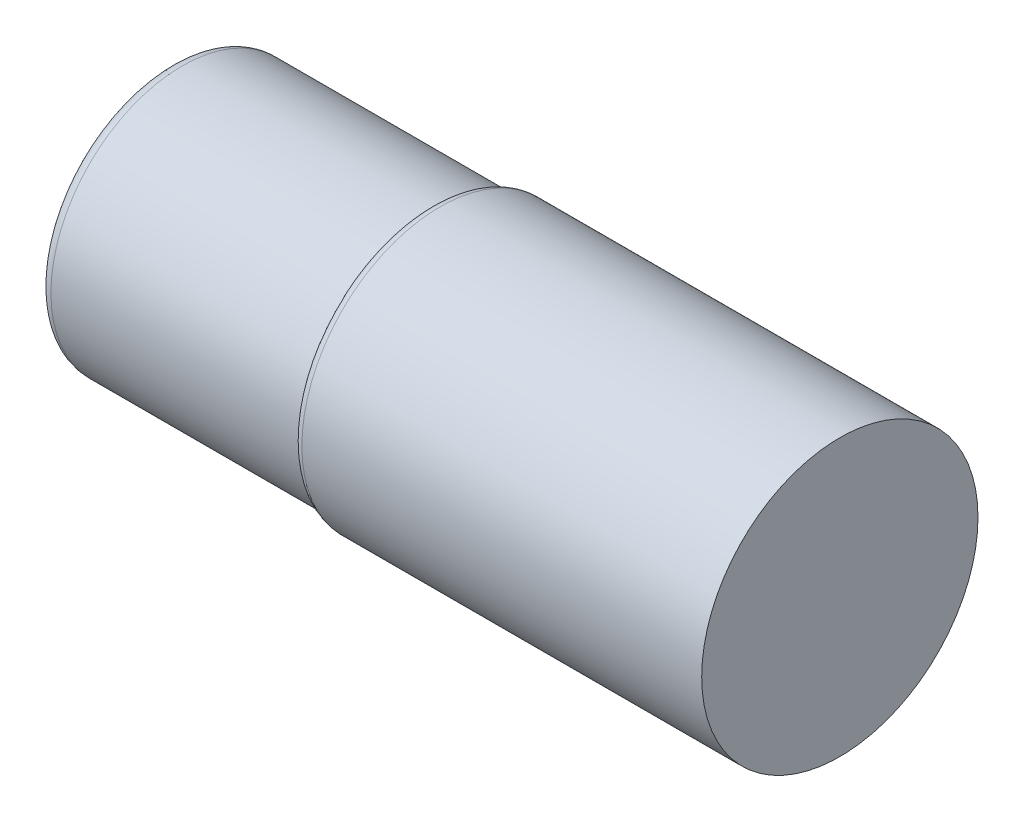
ISO-10303-21;
HEADER;
FILE_DESCRIPTION(('STEP AP214'),'2;1');
FILE_NAME('part.step','',(''),(''),'','','');
FILE_SCHEMA(('AUTOMOTIVE_DESIGN { 1 0 10303 214 1 1 1 1 }'));
ENDSEC;
DATA;
#1=APPLICATION_CONTEXT('core data for automotive mechanical design processes');
#2=APPLICATION_PROTOCOL_DEFINITION('international standard','automotive_design',2000,#1);
#3=PRODUCT_CONTEXT('',#1,'mechanical');
#4=PRODUCT('Part','Part','',(#3));
#5=PRODUCT_RELATED_PRODUCT_CATEGORY('part','',(#4));
#6=PRODUCT_DEFINITION_FORMATION('','',#4);
#7=PRODUCT_DEFINITION_CONTEXT('part definition',#1,'design');
#8=PRODUCT_DEFINITION('design','',#6,#7);
#9=PRODUCT_DEFINITION_SHAPE('','',#8);
#10=(LENGTH_UNIT() NAMED_UNIT(*) SI_UNIT(.MILLI.,.METRE.));
#11=(NAMED_UNIT(*) PLANE_ANGLE_UNIT() SI_UNIT($,.RADIAN.));
#12=(NAMED_UNIT(*) SI_UNIT($,.STERADIAN.) SOLID_ANGLE_UNIT());
#13=UNCERTAINTY_MEASURE_WITH_UNIT(LENGTH_MEASURE(1.E-05),#10,'distance_accuracy_value','');
#14=(GEOMETRIC_REPRESENTATION_CONTEXT(3) GLOBAL_UNCERTAINTY_ASSIGNED_CONTEXT((#13)) GLOBAL_UNIT_ASSIGNED_CONTEXT((#10,
#11,#12)) REPRESENTATION_CONTEXT('',''));
#15=CARTESIAN_POINT('',(0.,0.,0.));
#16=DIRECTION('',(0.,0.,1.));
#17=DIRECTION('',(1.,0.,0.));
#18=AXIS2_PLACEMENT_3D('',#15,#16,#17);
#19=CARTESIAN_POINT('',(111.2,0.,0.));
#20=DIRECTION('',(-1.,0.,0.));
#21=DIRECTION('',(0.,0.,1.));
#22=AXIS2_PLACEMENT_3D('',#19,#20,#21);
#23=PLANE('',#22);
#24=CARTESIAN_POINT('',(111.2,0.,0.));
#25=DIRECTION('',(-1.,0.,0.));
#26=DIRECTION('',(0.,0.,1.));
#27=AXIS2_PLACEMENT_3D('',#24,#25,#26);
#28=CIRCLE('',#27,23.15);
#29=CARTESIAN_POINT('',(111.2,0.,23.15));
#30=VERTEX_POINT('',#29);
#31=EDGE_CURVE('E95',#30,#30,#28,.T.);
#32=ORIENTED_EDGE('',*,*,#31,.F.);
#33=EDGE_LOOP('',(#32));
#34=FACE_BOUND('',#33,.T.);
#35=ADVANCED_FACE('F53',(#34),#23,.F.);
#36=CARTESIAN_POINT('',(0.,0.,0.));
#37=DIRECTION('',(-1.,0.,0.));
#38=DIRECTION('',(0.,0.,1.));
#39=AXIS2_PLACEMENT_3D('',#36,#37,#38);
#40=CYLINDRICAL_SURFACE('',#39,23.15);
#41=CARTESIAN_POINT('',(44.2,0.,0.));
#42=DIRECTION('',(-1.,0.,0.));
#43=DIRECTION('',(0.,0.,1.));
#44=AXIS2_PLACEMENT_3D('',#41,#42,#43);
#45=CIRCLE('',#44,23.15);
#46=CARTESIAN_POINT('',(44.2,0.,23.15));
#47=VERTEX_POINT('',#46);
#48=EDGE_CURVE('E100',#47,#47,#45,.T.);
#49=ORIENTED_EDGE('',*,*,#48,.F.);
#50=EDGE_LOOP('',(#49));
#51=FACE_BOUND('',#50,.T.);
#52=ORIENTED_EDGE('',*,*,#31,.T.);
#53=EDGE_LOOP('',(#52));
#54=FACE_BOUND('',#53,.T.);
#55=ADVANCED_FACE('F171',(#51,#54),#40,.T.);
#56=CARTESIAN_POINT('',(44.2,0.,0.));
#57=DIRECTION('',(-1.,0.,0.));
#58=DIRECTION('',(0.,0.,1.));
#59=AXIS2_PLACEMENT_3D('',#56,#57,#58);
#60=TOROIDAL_SURFACE('',#59,21.65,1.5);
#61=CARTESIAN_POINT('',(42.7414047854185,0.,0.));
#62=DIRECTION('',(1.,0.,0.));
#63=DIRECTION('',(0.,0.,-1.));
#64=AXIS2_PLACEMENT_3D('',#61,#62,#63);
#65=CIRCLE('',#64,22.);
#66=CARTESIAN_POINT('',(42.7414047854185,0.,-22.));
#67=VERTEX_POINT('',#66);
#68=EDGE_CURVE('E57',#67,#67,#65,.F.);
#69=ORIENTED_EDGE('',*,*,#68,.F.);
#70=EDGE_LOOP('',(#69));
#71=FACE_BOUND('',#70,.T.);
#72=ORIENTED_EDGE('',*,*,#48,.T.);
#73=EDGE_LOOP('',(#72));
#74=FACE_BOUND('',#73,.T.);
#75=ADVANCED_FACE('F55',(#71,#74),#60,.T.);
#76=CARTESIAN_POINT('',(0.,0.,0.));
#77=DIRECTION('',(-1.,0.,0.));
#78=DIRECTION('',(0.,0.,1.));
#79=AXIS2_PLACEMENT_3D('',#76,#77,#78);
#80=CYLINDRICAL_SURFACE('',#79,22.);
#81=CARTESIAN_POINT('',(1.,0.,0.));
#82=DIRECTION('',(-1.,0.,0.));
#83=DIRECTION('',(0.,0.,1.));
#84=AXIS2_PLACEMENT_3D('',#81,#82,#83);
#85=CIRCLE('',#84,22.);
#86=CARTESIAN_POINT('',(1.,0.,22.));
#87=VERTEX_POINT('',#86);
#88=EDGE_CURVE('E62',#87,#87,#85,.F.);
#89=ORIENTED_EDGE('',*,*,#88,.T.);
#90=EDGE_LOOP('',(#89));
#91=FACE_BOUND('',#90,.T.);
#92=ORIENTED_EDGE('',*,*,#68,.T.);
#93=EDGE_LOOP('',(#92));
#94=FACE_BOUND('',#93,.T.);
#95=ADVANCED_FACE('F151',(#91,#94),#80,.T.);
#96=CARTESIAN_POINT('',(-1.,0.,0.));
#97=DIRECTION('',(1.,0.,0.));
#98=DIRECTION('',(0.,0.,-1.));
#99=AXIS2_PLACEMENT_3D('',#96,#97,#98);
#100=PLANE('',#99);
#101=CARTESIAN_POINT('',(-1.,0.,0.));
#102=DIRECTION('',(1.,0.,0.));
#103=DIRECTION('',(0.,0.,-1.));
#104=AXIS2_PLACEMENT_3D('',#101,#102,#103);
#105=CIRCLE('',#104,20.);
#106=CARTESIAN_POINT('',(-1.,0.,-20.));
#107=VERTEX_POINT('',#106);
#108=EDGE_CURVE('E68',#107,#107,#105,.F.);
#109=ORIENTED_EDGE('',*,*,#108,.T.);
#110=EDGE_LOOP('',(#109));
#111=FACE_BOUND('',#110,.T.);
#112=CARTESIAN_POINT('',(-1.,0.,0.));
#113=DIRECTION('',(1.,0.,0.));
#114=DIRECTION('',(0.,0.,-1.));
#115=AXIS2_PLACEMENT_3D('',#112,#113,#114);
#116=CIRCLE('',#115,14.);
#117=CARTESIAN_POINT('',(-1.,0.,-14.));
#118=VERTEX_POINT('',#117);
#119=EDGE_CURVE('E99',#118,#118,#116,.F.);
#120=ORIENTED_EDGE('',*,*,#119,.F.);
#121=EDGE_LOOP('',(#120));
#122=FACE_BOUND('',#121,.T.);
#123=CARTESIAN_POINT('',(-0.999999999999999,-12.3743686707644,-12.3743686707647));
#124=DIRECTION('',(1.,0.,0.));
#125=DIRECTION('',(0.,0.,-1.));
#126=AXIS2_PLACEMENT_3D('',#123,#124,#125);
#127=CIRCLE('',#126,0.999999999999998);
#128=CARTESIAN_POINT('',(-0.999999999999999,-12.3743686707644,-13.3743686707647));
#129=VERTEX_POINT('',#128);
#130=EDGE_CURVE('E110',#129,#129,#127,.F.);
#131=ORIENTED_EDGE('',*,*,#130,.F.);
#132=EDGE_LOOP('',(#131));
#133=FACE_BOUND('',#132,.T.);
#134=CARTESIAN_POINT('',(-0.999999999999999,-12.3743686707647,12.3743686707645));
#135=DIRECTION('',(1.,0.,0.));
#136=DIRECTION('',(0.,0.,-1.));
#137=AXIS2_PLACEMENT_3D('',#134,#135,#136);
#138=CIRCLE('',#137,0.999999999999999);
#139=CARTESIAN_POINT('',(-0.999999999999999,-12.3743686707647,11.3743686707645));
#140=VERTEX_POINT('',#139);
#141=EDGE_CURVE('E115',#140,#140,#138,.F.);
#142=ORIENTED_EDGE('',*,*,#141,.F.);
#143=EDGE_LOOP('',(#142));
#144=FACE_BOUND('',#143,.T.);
#145=CARTESIAN_POINT('',(-0.999999999999999,12.3743686707645,12.3743686707646));
#146=DIRECTION('',(1.,0.,0.));
#147=DIRECTION('',(0.,0.,-1.));
#148=AXIS2_PLACEMENT_3D('',#145,#146,#147);
#149=CIRCLE('',#148,0.999999999999999);
#150=CARTESIAN_POINT('',(-0.999999999999999,12.3743686707645,11.3743686707646));
#151=VERTEX_POINT('',#150);
#152=EDGE_CURVE('E120',#151,#151,#149,.F.);
#153=ORIENTED_EDGE('',*,*,#152,.F.);
#154=EDGE_LOOP('',(#153));
#155=FACE_BOUND('',#154,.T.);
#156=CARTESIAN_POINT('',(-0.999999999999999,12.3743686707646,-12.3743686707646));
#157=DIRECTION('',(1.,0.,0.));
#158=DIRECTION('',(0.,0.,-1.));
#159=AXIS2_PLACEMENT_3D('',#156,#157,#158);
#160=CIRCLE('',#159,1.);
#161=CARTESIAN_POINT('',(-0.999999999999999,12.3743686707646,-13.3743686707646));
#162=VERTEX_POINT('',#161);
#163=EDGE_CURVE('E124',#162,#162,#160,.F.);
#164=ORIENTED_EDGE('',*,*,#163,.F.);
#165=EDGE_LOOP('',(#164));
#166=FACE_BOUND('',#165,.T.);
#167=ADVANCED_FACE('F147',(#111,#122,#133,#144,#155,#166),#100,.F.);
#168=CARTESIAN_POINT('',(10.,12.3743686707646,-12.3743686707646));
#169=DIRECTION('',(-1.,0.,0.));
#170=DIRECTION('',(0.,0.,1.));
#171=AXIS2_PLACEMENT_3D('',#168,#169,#170);
#172=CYLINDRICAL_SURFACE('',#171,1.);
#173=CARTESIAN_POINT('',(9.,12.3743686707646,-12.3743686707646));
#174=DIRECTION('',(-1.,0.,0.));
#175=DIRECTION('',(0.,0.,1.));
#176=AXIS2_PLACEMENT_3D('',#173,#174,#175);
#177=CIRCLE('',#176,1.);
#178=CARTESIAN_POINT('',(9.,12.3743686707646,-11.3743686707646));
#179=VERTEX_POINT('',#178);
#180=EDGE_CURVE('E128',#179,#179,#177,.T.);
#181=ORIENTED_EDGE('',*,*,#180,.F.);
#182=EDGE_LOOP('',(#181));
#183=FACE_BOUND('',#182,.T.);
#184=ORIENTED_EDGE('',*,*,#163,.T.);
#185=EDGE_LOOP('',(#184));
#186=FACE_BOUND('',#185,.T.);
#187=ADVANCED_FACE('F150',(#183,#186),#172,.F.);
#188=CARTESIAN_POINT('',(9.,12.3743686707646,-12.3743686707646));
#189=DIRECTION('',(-1.,0.,0.));
#190=DIRECTION('',(0.,0.,1.));
#191=AXIS2_PLACEMENT_3D('',#188,#189,#190);
#192=PLANE('',#191);
#193=ORIENTED_EDGE('',*,*,#180,.T.);
#194=EDGE_LOOP('',(#193));
#195=FACE_BOUND('',#194,.T.);
#196=ADVANCED_FACE('F159',(#195),#192,.T.);
#197=CARTESIAN_POINT('',(10.,12.3743686707645,12.3743686707646));
#198=DIRECTION('',(-1.,0.,0.));
#199=DIRECTION('',(0.,0.,1.));
#200=AXIS2_PLACEMENT_3D('',#197,#198,#199);
#201=CYLINDRICAL_SURFACE('',#200,0.999999999999999);
#202=CARTESIAN_POINT('',(9.,12.3743686707645,12.3743686707646));
#203=DIRECTION('',(-1.,0.,0.));
#204=DIRECTION('',(0.,0.,1.));
#205=AXIS2_PLACEMENT_3D('',#202,#203,#204);
#206=CIRCLE('',#205,0.999999999999999);
#207=CARTESIAN_POINT('',(9.,12.3743686707645,13.3743686707646));
#208=VERTEX_POINT('',#207);
#209=EDGE_CURVE('E119',#208,#208,#206,.T.);
#210=ORIENTED_EDGE('',*,*,#209,.F.);
#211=EDGE_LOOP('',(#210));
#212=FACE_BOUND('',#211,.T.);
#213=ORIENTED_EDGE('',*,*,#152,.T.);
#214=EDGE_LOOP('',(#213));
#215=FACE_BOUND('',#214,.T.);
#216=ADVANCED_FACE('F166',(#212,#215),#201,.F.);
#217=CARTESIAN_POINT('',(9.,12.3743686707645,12.3743686707646));
#218=DIRECTION('',(-1.,0.,0.));
#219=DIRECTION('',(0.,0.,1.));
#220=AXIS2_PLACEMENT_3D('',#217,#218,#219);
#221=PLANE('',#220);
#222=ORIENTED_EDGE('',*,*,#209,.T.);
#223=EDGE_LOOP('',(#222));
#224=FACE_BOUND('',#223,.T.);
#225=ADVANCED_FACE('F143',(#224),#221,.T.);
#226=CARTESIAN_POINT('',(10.,-12.3743686707647,12.3743686707645));
#227=DIRECTION('',(-1.,0.,0.));
#228=DIRECTION('',(0.,0.,1.));
#229=AXIS2_PLACEMENT_3D('',#226,#227,#228);
#230=CYLINDRICAL_SURFACE('',#229,0.999999999999999);
#231=CARTESIAN_POINT('',(9.,-12.3743686707647,12.3743686707645));
#232=DIRECTION('',(-1.,0.,0.));
#233=DIRECTION('',(0.,0.,1.));
#234=AXIS2_PLACEMENT_3D('',#231,#232,#233);
#235=CIRCLE('',#234,0.999999999999999);
#236=CARTESIAN_POINT('',(9.,-12.3743686707647,13.3743686707645));
#237=VERTEX_POINT('',#236);
#238=EDGE_CURVE('E114',#237,#237,#235,.T.);
#239=ORIENTED_EDGE('',*,*,#238,.F.);
#240=EDGE_LOOP('',(#239));
#241=FACE_BOUND('',#240,.T.);
#242=ORIENTED_EDGE('',*,*,#141,.T.);
#243=EDGE_LOOP('',(#242));
#244=FACE_BOUND('',#243,.T.);
#245=ADVANCED_FACE('F140',(#241,#244),#230,.F.);
#246=CARTESIAN_POINT('',(9.,-12.3743686707647,12.3743686707645));
#247=DIRECTION('',(-1.,0.,0.));
#248=DIRECTION('',(0.,0.,1.));
#249=AXIS2_PLACEMENT_3D('',#246,#247,#248);
#250=PLANE('',#249);
#251=ORIENTED_EDGE('',*,*,#238,.T.);
#252=EDGE_LOOP('',(#251));
#253=FACE_BOUND('',#252,.T.);
#254=ADVANCED_FACE('F138',(#253),#250,.T.);
#255=CARTESIAN_POINT('',(10.,-12.3743686707644,-12.3743686707647));
#256=DIRECTION('',(-1.,0.,0.));
#257=DIRECTION('',(0.,0.,1.));
#258=AXIS2_PLACEMENT_3D('',#255,#256,#257);
#259=CYLINDRICAL_SURFACE('',#258,0.999999999999998);
#260=CARTESIAN_POINT('',(9.,-12.3743686707644,-12.3743686707647));
#261=DIRECTION('',(-1.,0.,0.));
#262=DIRECTION('',(0.,0.,1.));
#263=AXIS2_PLACEMENT_3D('',#260,#261,#262);
#264=CIRCLE('',#263,0.999999999999998);
#265=CARTESIAN_POINT('',(9.,-12.3743686707644,-11.3743686707647));
#266=VERTEX_POINT('',#265);
#267=EDGE_CURVE('E72',#266,#266,#264,.T.);
#268=ORIENTED_EDGE('',*,*,#267,.F.);
#269=EDGE_LOOP('',(#268));
#270=FACE_BOUND('',#269,.T.);
#271=ORIENTED_EDGE('',*,*,#130,.T.);
#272=EDGE_LOOP('',(#271));
#273=FACE_BOUND('',#272,.T.);
#274=ADVANCED_FACE('F212',(#270,#273),#259,.F.);
#275=CARTESIAN_POINT('',(9.,-12.3743686707644,-12.3743686707647));
#276=DIRECTION('',(-1.,0.,0.));
#277=DIRECTION('',(0.,0.,1.));
#278=AXIS2_PLACEMENT_3D('',#275,#276,#277);
#279=PLANE('',#278);
#280=ORIENTED_EDGE('',*,*,#267,.T.);
#281=EDGE_LOOP('',(#280));
#282=FACE_BOUND('',#281,.T.);
#283=ADVANCED_FACE('F214',(#282),#279,.T.);
#284=CARTESIAN_POINT('',(-3.,0.,0.));
#285=DIRECTION('',(-1.,0.,0.));
#286=DIRECTION('',(0.,0.,1.));
#287=AXIS2_PLACEMENT_3D('',#284,#285,#286);
#288=PLANE('',#287);
#289=CARTESIAN_POINT('',(-3.,0.,0.));
#290=DIRECTION('',(-1.,0.,0.));
#291=DIRECTION('',(0.,0.,1.));
#292=AXIS2_PLACEMENT_3D('',#289,#290,#291);
#293=CIRCLE('',#292,10.);
#294=CARTESIAN_POINT('',(-3.,0.,10.));
#295=VERTEX_POINT('',#294);
#296=EDGE_CURVE('E74',#295,#295,#293,.T.);
#297=ORIENTED_EDGE('',*,*,#296,.F.);
#298=EDGE_LOOP('',(#297));
#299=FACE_BOUND('',#298,.T.);
#300=CARTESIAN_POINT('',(-3.,0.,0.));
#301=DIRECTION('',(-1.,0.,0.));
#302=DIRECTION('',(0.,0.,1.));
#303=AXIS2_PLACEMENT_3D('',#300,#301,#302);
#304=CIRCLE('',#303,12.);
#305=CARTESIAN_POINT('',(-3.,0.,12.));
#306=VERTEX_POINT('',#305);
#307=EDGE_CURVE('E12',#306,#306,#304,.T.);
#308=ORIENTED_EDGE('',*,*,#307,.T.);
#309=EDGE_LOOP('',(#308));
#310=FACE_BOUND('',#309,.T.);
#311=ADVANCED_FACE('F204',(#299,#310),#288,.T.);
#312=CARTESIAN_POINT('',(1.,0.,0.));
#313=DIRECTION('',(1.,0.,0.));
#314=DIRECTION('',(0.,0.,-1.));
#315=AXIS2_PLACEMENT_3D('',#312,#313,#314);
#316=TOROIDAL_SURFACE('',#315,20.,2.);
#317=ORIENTED_EDGE('',*,*,#88,.F.);
#318=EDGE_LOOP('',(#317));
#319=FACE_BOUND('',#318,.T.);
#320=ORIENTED_EDGE('',*,*,#108,.F.);
#321=EDGE_LOOP('',(#320));
#322=FACE_BOUND('',#321,.T.);
#323=ADVANCED_FACE('F200',(#319,#322),#316,.T.);
#324=CARTESIAN_POINT('',(-1.,0.,0.));
#325=DIRECTION('',(-1.,0.,0.));
#326=DIRECTION('',(0.,0.,1.));
#327=AXIS2_PLACEMENT_3D('',#324,#325,#326);
#328=TOROIDAL_SURFACE('',#327,12.,2.);
#329=ORIENTED_EDGE('',*,*,#119,.T.);
#330=EDGE_LOOP('',(#329));
#331=FACE_BOUND('',#330,.T.);
#332=ORIENTED_EDGE('',*,*,#307,.F.);
#333=EDGE_LOOP('',(#332));
#334=FACE_BOUND('',#333,.T.);
#335=ADVANCED_FACE('F203',(#331,#334),#328,.T.);
#336=CARTESIAN_POINT('',(8.,0.,0.));
#337=DIRECTION('',(-1.,0.,0.));
#338=DIRECTION('',(0.,0.,1.));
#339=AXIS2_PLACEMENT_3D('',#336,#337,#338);
#340=CYLINDRICAL_SURFACE('',#339,10.);
#341=CARTESIAN_POINT('',(8.,0.,0.));
#342=DIRECTION('',(-1.,0.,0.));
#343=DIRECTION('',(0.,0.,1.));
#344=AXIS2_PLACEMENT_3D('',#341,#342,#343);
#345=CIRCLE('',#344,10.);
#346=CARTESIAN_POINT('',(8.,0.,10.));
#347=VERTEX_POINT('',#346);
#348=EDGE_CURVE('E77',#347,#347,#345,.T.);
#349=ORIENTED_EDGE('',*,*,#348,.F.);
#350=EDGE_LOOP('',(#349));
#351=FACE_BOUND('',#350,.T.);
#352=ORIENTED_EDGE('',*,*,#296,.T.);
#353=EDGE_LOOP('',(#352));
#354=FACE_BOUND('',#353,.T.);
#355=ADVANCED_FACE('F230',(#351,#354),#340,.F.);
#356=CARTESIAN_POINT('',(110.2,0.,0.));
#357=DIRECTION('',(-1.,0.,0.));
#358=DIRECTION('',(0.,0.,1.));
#359=AXIS2_PLACEMENT_3D('',#356,#357,#358);
#360=PLANE('',#359);
#361=CARTESIAN_POINT('',(110.2,0.,0.));
#362=DIRECTION('',(-1.,0.,0.));
#363=DIRECTION('',(0.,0.,1.));
#364=AXIS2_PLACEMENT_3D('',#361,#362,#363);
#365=CIRCLE('',#364,22.15);
#366=CARTESIAN_POINT('',(110.2,0.,22.15));
#367=VERTEX_POINT('',#366);
#368=EDGE_CURVE('E280',#367,#367,#365,.T.);
#369=ORIENTED_EDGE('',*,*,#368,.T.);
#370=EDGE_LOOP('',(#369));
#371=FACE_BOUND('',#370,.T.);
#372=ADVANCED_FACE('F233',(#371),#360,.T.);
#373=CARTESIAN_POINT('',(0.,0.,0.));
#374=DIRECTION('',(-1.,0.,0.));
#375=DIRECTION('',(0.,0.,1.));
#376=AXIS2_PLACEMENT_3D('',#373,#374,#375);
#377=CYLINDRICAL_SURFACE('',#376,22.15);
#378=CARTESIAN_POINT('',(44.2,0.,0.));
#379=DIRECTION('',(-1.,0.,0.));
#380=DIRECTION('',(0.,0.,1.));
#381=AXIS2_PLACEMENT_3D('',#378,#379,#380);
#382=CIRCLE('',#381,22.15);
#383=CARTESIAN_POINT('',(44.2,0.,22.15));
#384=VERTEX_POINT('',#383);
#385=EDGE_CURVE('E285',#384,#384,#382,.T.);
#386=ORIENTED_EDGE('',*,*,#385,.T.);
#387=EDGE_LOOP('',(#386));
#388=FACE_BOUND('',#387,.T.);
#389=ORIENTED_EDGE('',*,*,#368,.F.);
#390=EDGE_LOOP('',(#389));
#391=FACE_BOUND('',#390,.T.);
#392=ADVANCED_FACE('F238',(#388,#391),#377,.F.);
#393=CARTESIAN_POINT('',(44.2,0.,0.));
#394=DIRECTION('',(-1.,0.,0.));
#395=DIRECTION('',(0.,0.,1.));
#396=AXIS2_PLACEMENT_3D('',#393,#394,#395);
#397=TOROIDAL_SURFACE('',#396,21.65,0.5);
#398=CARTESIAN_POINT('',(43.7,0.,0.));
#399=DIRECTION('',(-1.,0.,0.));
#400=DIRECTION('',(0.,0.,1.));
#401=AXIS2_PLACEMENT_3D('',#398,#399,#400);
#402=CIRCLE('',#401,21.65);
#403=CARTESIAN_POINT('',(43.7,0.,21.65));
#404=VERTEX_POINT('',#403);
#405=EDGE_CURVE('E289',#404,#404,#402,.T.);
#406=ORIENTED_EDGE('',*,*,#405,.T.);
#407=EDGE_LOOP('',(#406));
#408=FACE_BOUND('',#407,.T.);
#409=ORIENTED_EDGE('',*,*,#385,.F.);
#410=EDGE_LOOP('',(#409));
#411=FACE_BOUND('',#410,.T.);
#412=ADVANCED_FACE('F248',(#408,#411),#397,.F.);
#413=CARTESIAN_POINT('',(43.7,21.,0.));
#414=DIRECTION('',(1.,0.,0.));
#415=DIRECTION('',(0.,0.,-1.));
#416=AXIS2_PLACEMENT_3D('',#413,#414,#415);
#417=PLANE('',#416);
#418=CARTESIAN_POINT('',(43.7,0.,0.));
#419=DIRECTION('',(-1.,0.,0.));
#420=DIRECTION('',(0.,0.,1.));
#421=AXIS2_PLACEMENT_3D('',#418,#419,#420);
#422=CIRCLE('',#421,21.);
#423=CARTESIAN_POINT('',(43.7,0.,21.));
#424=VERTEX_POINT('',#423);
#425=EDGE_CURVE('E293',#424,#424,#422,.T.);
#426=ORIENTED_EDGE('',*,*,#425,.T.);
#427=EDGE_LOOP('',(#426));
#428=FACE_BOUND('',#427,.T.);
#429=ORIENTED_EDGE('',*,*,#405,.F.);
#430=EDGE_LOOP('',(#429));
#431=FACE_BOUND('',#430,.T.);
#432=ADVANCED_FACE('F388',(#428,#431),#417,.T.);
#433=CARTESIAN_POINT('',(0.,0.,0.));
#434=DIRECTION('',(-1.,0.,0.));
#435=DIRECTION('',(0.,0.,1.));
#436=AXIS2_PLACEMENT_3D('',#433,#434,#435);
#437=CYLINDRICAL_SURFACE('',#436,21.);
#438=CARTESIAN_POINT('',(1.,0.,0.));
#439=DIRECTION('',(1.,0.,0.));
#440=DIRECTION('',(0.,0.,-1.));
#441=AXIS2_PLACEMENT_3D('',#438,#439,#440);
#442=CIRCLE('',#441,21.);
#443=CARTESIAN_POINT('',(1.,0.,-21.));
#444=VERTEX_POINT('',#443);
#445=EDGE_CURVE('E91',#444,#444,#442,.T.);
#446=ORIENTED_EDGE('',*,*,#445,.F.);
#447=EDGE_LOOP('',(#446));
#448=FACE_BOUND('',#447,.T.);
#449=ORIENTED_EDGE('',*,*,#425,.F.);
#450=EDGE_LOOP('',(#449));
#451=FACE_BOUND('',#450,.T.);
#452=ADVANCED_FACE('F385',(#448,#451),#437,.F.);
#453=CARTESIAN_POINT('',(0.,0.,0.));
#454=DIRECTION('',(1.,0.,0.));
#455=DIRECTION('',(0.,0.,-1.));
#456=AXIS2_PLACEMENT_3D('',#453,#454,#455);
#457=PLANE('',#456);
#458=CARTESIAN_POINT('',(0.,0.,0.));
#459=DIRECTION('',(1.,0.,0.));
#460=DIRECTION('',(0.,0.,-1.));
#461=AXIS2_PLACEMENT_3D('',#458,#459,#460);
#462=CIRCLE('',#461,20.);
#463=CARTESIAN_POINT('',(0.,0.,-20.));
#464=VERTEX_POINT('',#463);
#465=EDGE_CURVE('E272',#464,#464,#462,.F.);
#466=ORIENTED_EDGE('',*,*,#465,.F.);
#467=EDGE_LOOP('',(#466));
#468=FACE_BOUND('',#467,.T.);
#469=CARTESIAN_POINT('',(0.,0.,0.));
#470=DIRECTION('',(1.,0.,0.));
#471=DIRECTION('',(0.,0.,-1.));
#472=AXIS2_PLACEMENT_3D('',#469,#470,#471);
#473=CIRCLE('',#472,13.);
#474=CARTESIAN_POINT('',(0.,0.,-13.));
#475=VERTEX_POINT('',#474);
#476=EDGE_CURVE('E275',#475,#475,#473,.F.);
#477=ORIENTED_EDGE('',*,*,#476,.T.);
#478=EDGE_LOOP('',(#477));
#479=FACE_BOUND('',#478,.T.);
#480=CARTESIAN_POINT('',(0.,-12.3743686707644,-12.3743686707647));
#481=DIRECTION('',(-1.,0.,0.));
#482=DIRECTION('',(0.,0.,1.));
#483=AXIS2_PLACEMENT_3D('',#480,#481,#482);
#484=CIRCLE('',#483,2.);
#485=CARTESIAN_POINT('',(0.,-12.3743686707644,-10.3743686707647));
#486=VERTEX_POINT('',#485);
#487=EDGE_CURVE('E310',#486,#486,#484,.T.);
#488=ORIENTED_EDGE('',*,*,#487,.T.);
#489=EDGE_LOOP('',(#488));
#490=FACE_BOUND('',#489,.T.);
#491=CARTESIAN_POINT('',(0.,-12.3743686707647,12.3743686707645));
#492=DIRECTION('',(-1.,0.,0.));
#493=DIRECTION('',(0.,0.,1.));
#494=AXIS2_PLACEMENT_3D('',#491,#492,#493);
#495=CIRCLE('',#494,2.);
#496=CARTESIAN_POINT('',(0.,-12.3743686707647,14.3743686707645));
#497=VERTEX_POINT('',#496);
#498=EDGE_CURVE('E319',#497,#497,#495,.T.);
#499=ORIENTED_EDGE('',*,*,#498,.T.);
#500=EDGE_LOOP('',(#499));
#501=FACE_BOUND('',#500,.T.);
#502=CARTESIAN_POINT('',(0.,12.3743686707645,12.3743686707646));
#503=DIRECTION('',(-1.,0.,0.));
#504=DIRECTION('',(0.,0.,1.));
#505=AXIS2_PLACEMENT_3D('',#502,#503,#504);
#506=CIRCLE('',#505,2.);
#507=CARTESIAN_POINT('',(0.,12.3743686707645,14.3743686707646));
#508=VERTEX_POINT('',#507);
#509=EDGE_CURVE('E302',#508,#508,#506,.T.);
#510=ORIENTED_EDGE('',*,*,#509,.T.);
#511=EDGE_LOOP('',(#510));
#512=FACE_BOUND('',#511,.T.);
#513=CARTESIAN_POINT('',(0.,12.3743686707646,-12.3743686707646));
#514=DIRECTION('',(-1.,0.,0.));
#515=DIRECTION('',(0.,0.,1.));
#516=AXIS2_PLACEMENT_3D('',#513,#514,#515);
#517=CIRCLE('',#516,2.);
#518=CARTESIAN_POINT('',(0.,12.3743686707646,-10.3743686707646));
#519=VERTEX_POINT('',#518);
#520=EDGE_CURVE('E298',#519,#519,#517,.T.);
#521=ORIENTED_EDGE('',*,*,#520,.T.);
#522=EDGE_LOOP('',(#521));
#523=FACE_BOUND('',#522,.T.);
#524=ADVANCED_FACE('F381',(#468,#479,#490,#501,#512,#523),#457,.T.);
#525=CARTESIAN_POINT('',(10.,12.3743686707646,-12.3743686707646));
#526=DIRECTION('',(-1.,0.,0.));
#527=DIRECTION('',(0.,0.,1.));
#528=AXIS2_PLACEMENT_3D('',#525,#526,#527);
#529=CYLINDRICAL_SURFACE('',#528,2.);
#530=CARTESIAN_POINT('',(10.,12.3743686707646,-12.3743686707646));
#531=DIRECTION('',(-1.,0.,0.));
#532=DIRECTION('',(0.,0.,1.));
#533=AXIS2_PLACEMENT_3D('',#530,#531,#532);
#534=CIRCLE('',#533,2.);
#535=CARTESIAN_POINT('',(10.,12.3743686707646,-10.3743686707646));
#536=VERTEX_POINT('',#535);
#537=EDGE_CURVE('E297',#536,#536,#534,.T.);
#538=ORIENTED_EDGE('',*,*,#537,.T.);
#539=EDGE_LOOP('',(#538));
#540=FACE_BOUND('',#539,.T.);
#541=ORIENTED_EDGE('',*,*,#520,.F.);
#542=EDGE_LOOP('',(#541));
#543=FACE_BOUND('',#542,.T.);
#544=ADVANCED_FACE('F377',(#540,#543),#529,.T.);
#545=CARTESIAN_POINT('',(10.,12.3743686707646,-12.3743686707646));
#546=DIRECTION('',(-1.,0.,0.));
#547=DIRECTION('',(0.,0.,1.));
#548=AXIS2_PLACEMENT_3D('',#545,#546,#547);
#549=PLANE('',#548);
#550=ORIENTED_EDGE('',*,*,#537,.F.);
#551=EDGE_LOOP('',(#550));
#552=FACE_BOUND('',#551,.T.);
#553=ADVANCED_FACE('F355',(#552),#549,.F.);
#554=CARTESIAN_POINT('',(10.,12.3743686707645,12.3743686707646));
#555=DIRECTION('',(-1.,0.,0.));
#556=DIRECTION('',(0.,0.,1.));
#557=AXIS2_PLACEMENT_3D('',#554,#555,#556);
#558=CYLINDRICAL_SURFACE('',#557,2.);
#559=CARTESIAN_POINT('',(10.,12.3743686707645,12.3743686707646));
#560=DIRECTION('',(-1.,0.,0.));
#561=DIRECTION('',(0.,0.,1.));
#562=AXIS2_PLACEMENT_3D('',#559,#560,#561);
#563=CIRCLE('',#562,2.);
#564=CARTESIAN_POINT('',(10.,12.3743686707645,14.3743686707646));
#565=VERTEX_POINT('',#564);
#566=EDGE_CURVE('E323',#565,#565,#563,.T.);
#567=ORIENTED_EDGE('',*,*,#566,.T.);
#568=EDGE_LOOP('',(#567));
#569=FACE_BOUND('',#568,.T.);
#570=ORIENTED_EDGE('',*,*,#509,.F.);
#571=EDGE_LOOP('',(#570));
#572=FACE_BOUND('',#571,.T.);
#573=ADVANCED_FACE('F351',(#569,#572),#558,.T.);
#574=CARTESIAN_POINT('',(10.,12.3743686707645,12.3743686707646));
#575=DIRECTION('',(-1.,0.,0.));
#576=DIRECTION('',(0.,0.,1.));
#577=AXIS2_PLACEMENT_3D('',#574,#575,#576);
#578=PLANE('',#577);
#579=ORIENTED_EDGE('',*,*,#566,.F.);
#580=EDGE_LOOP('',(#579));
#581=FACE_BOUND('',#580,.T.);
#582=ADVANCED_FACE('F354',(#581),#578,.F.);
#583=CARTESIAN_POINT('',(10.,-12.3743686707647,12.3743686707645));
#584=DIRECTION('',(-1.,0.,0.));
#585=DIRECTION('',(0.,0.,1.));
#586=AXIS2_PLACEMENT_3D('',#583,#584,#585);
#587=CYLINDRICAL_SURFACE('',#586,2.);
#588=CARTESIAN_POINT('',(10.,-12.3743686707647,12.3743686707645));
#589=DIRECTION('',(-1.,0.,0.));
#590=DIRECTION('',(0.,0.,1.));
#591=AXIS2_PLACEMENT_3D('',#588,#589,#590);
#592=CIRCLE('',#591,2.);
#593=CARTESIAN_POINT('',(10.,-12.3743686707647,14.3743686707645));
#594=VERTEX_POINT('',#593);
#595=EDGE_CURVE('E315',#594,#594,#592,.T.);
#596=ORIENTED_EDGE('',*,*,#595,.T.);
#597=EDGE_LOOP('',(#596));
#598=FACE_BOUND('',#597,.T.);
#599=ORIENTED_EDGE('',*,*,#498,.F.);
#600=EDGE_LOOP('',(#599));
#601=FACE_BOUND('',#600,.T.);
#602=ADVANCED_FACE('F359',(#598,#601),#587,.T.);
#603=CARTESIAN_POINT('',(10.,-12.3743686707647,12.3743686707645));
#604=DIRECTION('',(-1.,0.,0.));
#605=DIRECTION('',(0.,0.,1.));
#606=AXIS2_PLACEMENT_3D('',#603,#604,#605);
#607=PLANE('',#606);
#608=ORIENTED_EDGE('',*,*,#595,.F.);
#609=EDGE_LOOP('',(#608));
#610=FACE_BOUND('',#609,.T.);
#611=ADVANCED_FACE('F363',(#610),#607,.F.);
#612=CARTESIAN_POINT('',(10.,-12.3743686707644,-12.3743686707647));
#613=DIRECTION('',(-1.,0.,0.));
#614=DIRECTION('',(0.,0.,1.));
#615=AXIS2_PLACEMENT_3D('',#612,#613,#614);
#616=CYLINDRICAL_SURFACE('',#615,2.);
#617=CARTESIAN_POINT('',(10.,-12.3743686707644,-12.3743686707647));
#618=DIRECTION('',(-1.,0.,0.));
#619=DIRECTION('',(0.,0.,1.));
#620=AXIS2_PLACEMENT_3D('',#617,#618,#619);
#621=CIRCLE('',#620,2.);
#622=CARTESIAN_POINT('',(10.,-12.3743686707644,-10.3743686707647));
#623=VERTEX_POINT('',#622);
#624=EDGE_CURVE('E306',#623,#623,#621,.T.);
#625=ORIENTED_EDGE('',*,*,#624,.T.);
#626=EDGE_LOOP('',(#625));
#627=FACE_BOUND('',#626,.T.);
#628=ORIENTED_EDGE('',*,*,#487,.F.);
#629=EDGE_LOOP('',(#628));
#630=FACE_BOUND('',#629,.T.);
#631=ADVANCED_FACE('F367',(#627,#630),#616,.T.);
#632=CARTESIAN_POINT('',(10.,-12.3743686707644,-12.3743686707647));
#633=DIRECTION('',(-1.,0.,0.));
#634=DIRECTION('',(0.,0.,1.));
#635=AXIS2_PLACEMENT_3D('',#632,#633,#634);
#636=PLANE('',#635);
#637=ORIENTED_EDGE('',*,*,#624,.F.);
#638=EDGE_LOOP('',(#637));
#639=FACE_BOUND('',#638,.T.);
#640=ADVANCED_FACE('F349',(#639),#636,.F.);
#641=CARTESIAN_POINT('',(-2.,0.,0.));
#642=DIRECTION('',(1.,0.,0.));
#643=DIRECTION('',(0.,0.,-1.));
#644=AXIS2_PLACEMENT_3D('',#641,#642,#643);
#645=CYLINDRICAL_SURFACE('',#644,13.);
#646=CARTESIAN_POINT('',(-1.,0.,0.));
#647=DIRECTION('',(-1.,0.,0.));
#648=DIRECTION('',(0.,0.,1.));
#649=AXIS2_PLACEMENT_3D('',#646,#647,#648);
#650=CIRCLE('',#649,13.);
#651=CARTESIAN_POINT('',(-1.,0.,13.));
#652=VERTEX_POINT('',#651);
#653=EDGE_CURVE('E80',#652,#652,#650,.F.);
#654=ORIENTED_EDGE('',*,*,#653,.F.);
#655=EDGE_LOOP('',(#654));
#656=FACE_BOUND('',#655,.T.);
#657=ORIENTED_EDGE('',*,*,#476,.F.);
#658=EDGE_LOOP('',(#657));
#659=FACE_BOUND('',#658,.T.);
#660=ADVANCED_FACE('F264',(#656,#659),#645,.F.);
#661=CARTESIAN_POINT('',(-2.,0.,0.));
#662=DIRECTION('',(-1.,0.,0.));
#663=DIRECTION('',(0.,0.,1.));
#664=AXIS2_PLACEMENT_3D('',#661,#662,#663);
#665=PLANE('',#664);
#666=CARTESIAN_POINT('',(-2.,0.,0.));
#667=DIRECTION('',(-1.,0.,0.));
#668=DIRECTION('',(0.,0.,1.));
#669=AXIS2_PLACEMENT_3D('',#666,#667,#668);
#670=CIRCLE('',#669,11.);
#671=CARTESIAN_POINT('',(-2.,0.,11.));
#672=VERTEX_POINT('',#671);
#673=EDGE_CURVE('E330',#672,#672,#670,.T.);
#674=ORIENTED_EDGE('',*,*,#673,.T.);
#675=EDGE_LOOP('',(#674));
#676=FACE_BOUND('',#675,.T.);
#677=CARTESIAN_POINT('',(-2.,0.,0.));
#678=DIRECTION('',(-1.,0.,0.));
#679=DIRECTION('',(0.,0.,1.));
#680=AXIS2_PLACEMENT_3D('',#677,#678,#679);
#681=CIRCLE('',#680,12.);
#682=CARTESIAN_POINT('',(-2.,0.,12.));
#683=VERTEX_POINT('',#682);
#684=EDGE_CURVE('E85',#683,#683,#681,.T.);
#685=ORIENTED_EDGE('',*,*,#684,.F.);
#686=EDGE_LOOP('',(#685));
#687=FACE_BOUND('',#686,.T.);
#688=ADVANCED_FACE('F255',(#676,#687),#665,.F.);
#689=CARTESIAN_POINT('',(1.,0.,0.));
#690=DIRECTION('',(1.,0.,0.));
#691=DIRECTION('',(0.,0.,-1.));
#692=AXIS2_PLACEMENT_3D('',#689,#690,#691);
#693=TOROIDAL_SURFACE('',#692,20.,1.);
#694=ORIENTED_EDGE('',*,*,#445,.T.);
#695=EDGE_LOOP('',(#694));
#696=FACE_BOUND('',#695,.T.);
#697=ORIENTED_EDGE('',*,*,#465,.T.);
#698=EDGE_LOOP('',(#697));
#699=FACE_BOUND('',#698,.T.);
#700=ADVANCED_FACE('F253',(#696,#699),#693,.F.);
#701=CARTESIAN_POINT('',(-1.,0.,0.));
#702=DIRECTION('',(-1.,0.,0.));
#703=DIRECTION('',(0.,0.,1.));
#704=AXIS2_PLACEMENT_3D('',#701,#702,#703);
#705=TOROIDAL_SURFACE('',#704,12.,1.);
#706=ORIENTED_EDGE('',*,*,#653,.T.);
#707=EDGE_LOOP('',(#706));
#708=FACE_BOUND('',#707,.T.);
#709=ORIENTED_EDGE('',*,*,#684,.T.);
#710=EDGE_LOOP('',(#709));
#711=FACE_BOUND('',#710,.T.);
#712=ADVANCED_FACE('F181',(#708,#711),#705,.F.);
#713=CARTESIAN_POINT('',(8.,0.,0.));
#714=DIRECTION('',(-1.,0.,0.));
#715=DIRECTION('',(0.,0.,1.));
#716=AXIS2_PLACEMENT_3D('',#713,#714,#715);
#717=CYLINDRICAL_SURFACE('',#716,11.);
#718=CARTESIAN_POINT('',(8.,0.,0.));
#719=DIRECTION('',(-1.,0.,0.));
#720=DIRECTION('',(0.,0.,1.));
#721=AXIS2_PLACEMENT_3D('',#718,#719,#720);
#722=CIRCLE('',#721,11.);
#723=CARTESIAN_POINT('',(8.,0.,11.));
#724=VERTEX_POINT('',#723);
#725=EDGE_CURVE('E311',#724,#724,#722,.T.);
#726=ORIENTED_EDGE('',*,*,#725,.T.);
#727=EDGE_LOOP('',(#726));
#728=FACE_BOUND('',#727,.T.);
#729=ORIENTED_EDGE('',*,*,#673,.F.);
#730=EDGE_LOOP('',(#729));
#731=FACE_BOUND('',#730,.T.);
#732=ADVANCED_FACE('F262',(#728,#731),#717,.T.);
#733=CARTESIAN_POINT('',(8.,0.,0.));
#734=DIRECTION('',(-1.,0.,0.));
#735=DIRECTION('',(0.,0.,1.));
#736=AXIS2_PLACEMENT_3D('',#733,#734,#735);
#737=PLANE('',#736);
#738=ORIENTED_EDGE('',*,*,#348,.T.);
#739=EDGE_LOOP('',(#738));
#740=FACE_BOUND('',#739,.T.);
#741=ORIENTED_EDGE('',*,*,#725,.F.);
#742=EDGE_LOOP('',(#741));
#743=FACE_BOUND('',#742,.T.);
#744=ADVANCED_FACE('F340',(#740,#743),#737,.F.);
#745=CLOSED_SHELL('',(#35,#55,#75,#95,#167,#187,#196,#216,#225,#245,#254,#274,#283,#311,#323,
#335,#355,#372,#392,#412,#432,#452,#524,#544,#553,#573,#582,#602,#611,#631,#640,#660,#688,#700,
#712,#732,#744));
#746=MANIFOLD_SOLID_BREP('B2',#745);
#747=ADVANCED_BREP_SHAPE_REPRESENTATION('',(#18,#746),#14);
#748=SHAPE_DEFINITION_REPRESENTATION(#9,#747);
ENDSEC;
END-ISO-10303-21;
